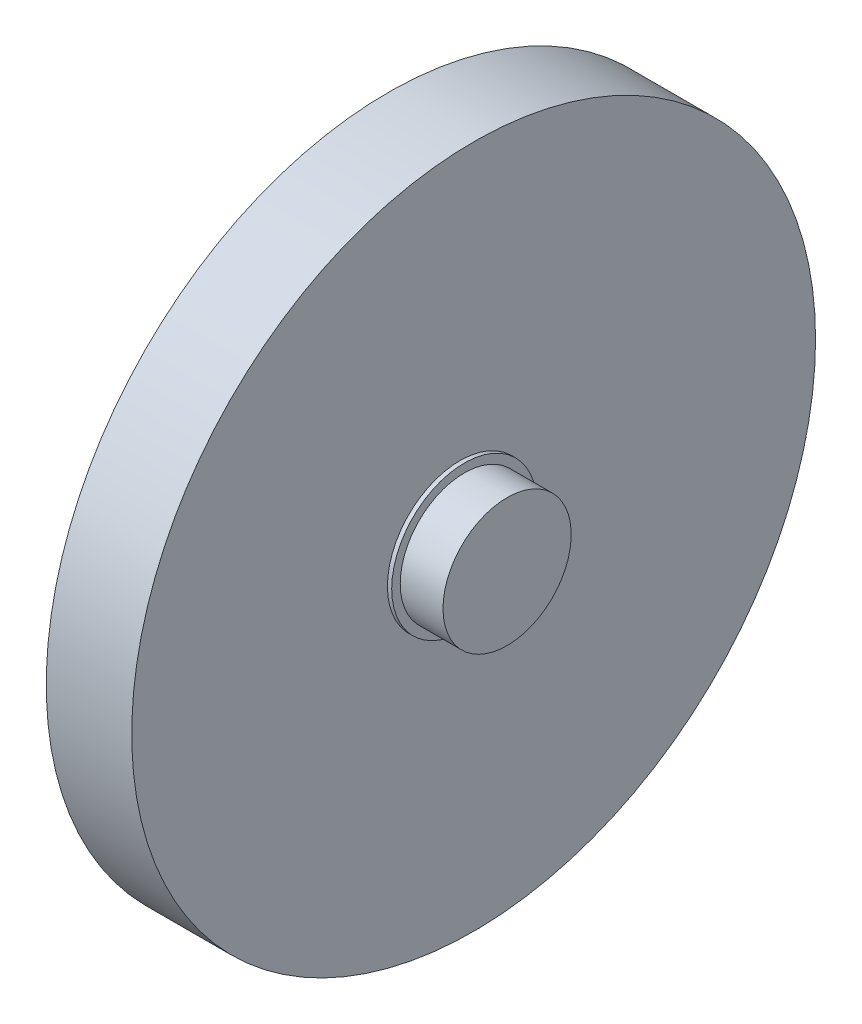
ISO-10303-21;
HEADER;
FILE_DESCRIPTION(('STEP AP214'),'2;1');
FILE_NAME('part.step','',(''),(''),'','','');
FILE_SCHEMA(('AUTOMOTIVE_DESIGN { 1 0 10303 214 1 1 1 1 }'));
ENDSEC;
DATA;
#1=APPLICATION_CONTEXT('core data for automotive mechanical design processes');
#2=APPLICATION_PROTOCOL_DEFINITION('international standard','automotive_design',2000,#1);
#3=PRODUCT_CONTEXT('',#1,'mechanical');
#4=PRODUCT('Part','Part','',(#3));
#5=PRODUCT_RELATED_PRODUCT_CATEGORY('part','',(#4));
#6=PRODUCT_DEFINITION_FORMATION('','',#4);
#7=PRODUCT_DEFINITION_CONTEXT('part definition',#1,'design');
#8=PRODUCT_DEFINITION('design','',#6,#7);
#9=PRODUCT_DEFINITION_SHAPE('','',#8);
#10=(LENGTH_UNIT() NAMED_UNIT(*) SI_UNIT(.MILLI.,.METRE.));
#11=(NAMED_UNIT(*) PLANE_ANGLE_UNIT() SI_UNIT($,.RADIAN.));
#12=(NAMED_UNIT(*) SI_UNIT($,.STERADIAN.) SOLID_ANGLE_UNIT());
#13=UNCERTAINTY_MEASURE_WITH_UNIT(LENGTH_MEASURE(1.E-05),#10,'distance_accuracy_value','');
#14=(GEOMETRIC_REPRESENTATION_CONTEXT(3) GLOBAL_UNCERTAINTY_ASSIGNED_CONTEXT((#13)) GLOBAL_UNIT_ASSIGNED_CONTEXT((#10,
#11,#12)) REPRESENTATION_CONTEXT('',''));
#15=CARTESIAN_POINT('',(0.,0.,0.));
#16=DIRECTION('',(0.,0.,1.));
#17=DIRECTION('',(1.,0.,0.));
#18=AXIS2_PLACEMENT_3D('',#15,#16,#17);
#19=CARTESIAN_POINT('',(7.,26.685292852244,8.67057724743726));
#20=DIRECTION('',(-1.,0.,0.));
#21=DIRECTION('',(0.,0.,1.));
#22=AXIS2_PLACEMENT_3D('',#19,#20,#21);
#23=CYLINDRICAL_SURFACE('',#22,6.86642262313004);
#24=CARTESIAN_POINT('',(0.,26.685292852244,8.67057724743726));
#25=DIRECTION('',(1.,0.,0.));
#26=DIRECTION('',(0.,0.,-1.));
#27=AXIS2_PLACEMENT_3D('',#24,#25,#26);
#28=CIRCLE('',#27,6.86642262313004);
#29=CARTESIAN_POINT('',(0.,30.1485889452472,2.74155204833238));
#30=VERTEX_POINT('',#29);
#31=CARTESIAN_POINT('',(0.,26.0021646755316,15.5029337613798));
#32=VERTEX_POINT('',#31);
#33=EDGE_CURVE('E218',#30,#32,#28,.T.);
#34=ORIENTED_EDGE('',*,*,#33,.F.);
#35=DIRECTION('',(-1.,0.,0.));
#36=VECTOR('',#35,1.);
#37=CARTESIAN_POINT('',(7.,30.1485889452472,2.74155204833238));
#38=LINE('',#37,#36);
#39=CARTESIAN_POINT('',(7.,30.1485889452472,2.74155204833238));
#40=VERTEX_POINT('',#39);
#41=EDGE_CURVE('E11',#40,#30,#38,.T.);
#42=ORIENTED_EDGE('',*,*,#41,.F.);
#43=CARTESIAN_POINT('',(7.,26.685292852244,8.67057724743726));
#44=DIRECTION('',(1.,0.,0.));
#45=DIRECTION('',(0.,0.,-1.));
#46=AXIS2_PLACEMENT_3D('',#43,#44,#45);
#47=CIRCLE('',#46,6.86642262313004);
#48=CARTESIAN_POINT('',(7.,26.0021646755316,15.5029337613798));
#49=VERTEX_POINT('',#48);
#50=EDGE_CURVE('E278',#40,#49,#47,.T.);
#51=ORIENTED_EDGE('',*,*,#50,.T.);
#52=DIRECTION('',(-1.,0.,0.));
#53=VECTOR('',#52,1.);
#54=CARTESIAN_POINT('',(7.,26.0021646755316,15.5029337613798));
#55=LINE('',#54,#53);
#56=EDGE_CURVE('E129',#49,#32,#55,.T.);
#57=ORIENTED_EDGE('',*,*,#56,.T.);
#58=EDGE_LOOP('',(#34,#42,#51,#57));
#59=FACE_BOUND('',#58,.T.);
#60=ADVANCED_FACE('F43',(#59),#23,.F.);
#61=CARTESIAN_POINT('',(7.,31.75,0.));
#62=DIRECTION('',(-1.,0.,0.));
#63=DIRECTION('',(0.,0.,1.));
#64=AXIS2_PLACEMENT_3D('',#61,#62,#63);
#65=CYLINDRICAL_SURFACE('',#64,3.175);
#66=CARTESIAN_POINT('',(0.,31.75,0.));
#67=DIRECTION('',(1.,0.,0.));
#68=DIRECTION('',(0.,0.,-1.));
#69=AXIS2_PLACEMENT_3D('',#66,#67,#68);
#70=CIRCLE('',#69,3.175);
#71=CARTESIAN_POINT('',(0.,30.1485889452472,-2.74155204833238));
#72=VERTEX_POINT('',#71);
#73=EDGE_CURVE('E221',#30,#72,#70,.T.);
#74=ORIENTED_EDGE('',*,*,#73,.T.);
#75=DIRECTION('',(-1.,0.,0.));
#76=VECTOR('',#75,1.);
#77=CARTESIAN_POINT('',(7.,30.1485889452472,-2.74155204833238));
#78=LINE('',#77,#76);
#79=CARTESIAN_POINT('',(7.,30.1485889452472,-2.74155204833238));
#80=VERTEX_POINT('',#79);
#81=EDGE_CURVE('E51',#80,#72,#78,.T.);
#82=ORIENTED_EDGE('',*,*,#81,.F.);
#83=CARTESIAN_POINT('',(7.,31.75,0.));
#84=DIRECTION('',(1.,0.,0.));
#85=DIRECTION('',(0.,0.,-1.));
#86=AXIS2_PLACEMENT_3D('',#83,#84,#85);
#87=CIRCLE('',#86,3.175);
#88=EDGE_CURVE('E333',#40,#80,#87,.T.);
#89=ORIENTED_EDGE('',*,*,#88,.F.);
#90=ORIENTED_EDGE('',*,*,#41,.T.);
#91=EDGE_LOOP('',(#74,#82,#89,#90));
#92=FACE_BOUND('',#91,.T.);
#93=ADVANCED_FACE('F317',(#92),#65,.T.);
#94=CARTESIAN_POINT('',(7.,26.6852928522439,-8.67057724743725));
#95=DIRECTION('',(-1.,0.,0.));
#96=DIRECTION('',(0.,0.,1.));
#97=AXIS2_PLACEMENT_3D('',#94,#95,#96);
#98=CYLINDRICAL_SURFACE('',#97,6.86642262313005);
#99=CARTESIAN_POINT('',(0.,26.6852928522439,-8.67057724743725));
#100=DIRECTION('',(1.,0.,0.));
#101=DIRECTION('',(0.,0.,-1.));
#102=AXIS2_PLACEMENT_3D('',#99,#100,#101);
#103=CIRCLE('',#102,6.86642262313005);
#104=CARTESIAN_POINT('',(0.,26.0021646755317,-15.5029337613799));
#105=VERTEX_POINT('',#104);
#106=EDGE_CURVE('E225',#105,#72,#103,.T.);
#107=ORIENTED_EDGE('',*,*,#106,.F.);
#108=DIRECTION('',(-1.,0.,0.));
#109=VECTOR('',#108,1.);
#110=CARTESIAN_POINT('',(7.,26.0021646755317,-15.5029337613799));
#111=LINE('',#110,#109);
#112=CARTESIAN_POINT('',(7.,26.0021646755317,-15.5029337613799));
#113=VERTEX_POINT('',#112);
#114=EDGE_CURVE('E307',#113,#105,#111,.T.);
#115=ORIENTED_EDGE('',*,*,#114,.F.);
#116=CARTESIAN_POINT('',(7.,26.6852928522439,-8.67057724743725));
#117=DIRECTION('',(1.,0.,0.));
#118=DIRECTION('',(0.,0.,-1.));
#119=AXIS2_PLACEMENT_3D('',#116,#117,#118);
#120=CIRCLE('',#119,6.86642262313005);
#121=EDGE_CURVE('E313',#113,#80,#120,.T.);
#122=ORIENTED_EDGE('',*,*,#121,.T.);
#123=ORIENTED_EDGE('',*,*,#81,.T.);
#124=EDGE_LOOP('',(#107,#115,#122,#123));
#125=FACE_BOUND('',#124,.T.);
#126=ADVANCED_FACE('F311',(#125),#98,.F.);
#127=CARTESIAN_POINT('',(7.,25.6862895714046,-18.662181760286));
#128=DIRECTION('',(-1.,0.,0.));
#129=DIRECTION('',(0.,0.,1.));
#130=AXIS2_PLACEMENT_3D('',#127,#128,#129);
#131=CYLINDRICAL_SURFACE('',#130,3.17499999999999);
#132=CARTESIAN_POINT('',(0.,25.6862895714046,-18.662181760286));
#133=DIRECTION('',(1.,0.,0.));
#134=DIRECTION('',(0.,0.,-1.));
#135=AXIS2_PLACEMENT_3D('',#132,#133,#134);
#136=CIRCLE('',#135,3.17499999999999);
#137=CARTESIAN_POINT('',(0.,22.7792769507277,-19.9388581575085));
#138=VERTEX_POINT('',#137);
#139=EDGE_CURVE('E228',#105,#138,#136,.T.);
#140=ORIENTED_EDGE('',*,*,#139,.T.);
#141=DIRECTION('',(-1.,0.,0.));
#142=VECTOR('',#141,1.);
#143=CARTESIAN_POINT('',(7.,22.7792769507277,-19.9388581575085));
#144=LINE('',#143,#142);
#145=CARTESIAN_POINT('',(7.,22.7792769507277,-19.9388581575085));
#146=VERTEX_POINT('',#145);
#147=EDGE_CURVE('E305',#146,#138,#144,.T.);
#148=ORIENTED_EDGE('',*,*,#147,.F.);
#149=CARTESIAN_POINT('',(7.,25.6862895714046,-18.662181760286));
#150=DIRECTION('',(1.,0.,0.));
#151=DIRECTION('',(0.,0.,-1.));
#152=AXIS2_PLACEMENT_3D('',#149,#150,#151);
#153=CIRCLE('',#152,3.17499999999999);
#154=EDGE_CURVE('E329',#113,#146,#153,.T.);
#155=ORIENTED_EDGE('',*,*,#154,.F.);
#156=ORIENTED_EDGE('',*,*,#114,.T.);
#157=EDGE_LOOP('',(#140,#148,#155,#156));
#158=FACE_BOUND('',#157,.T.);
#159=ADVANCED_FACE('F325',(#158),#131,.T.);
#160=CARTESIAN_POINT('',(7.,16.4924179824314,-22.6998659358722));
#161=DIRECTION('',(-1.,0.,0.));
#162=DIRECTION('',(0.,0.,1.));
#163=AXIS2_PLACEMENT_3D('',#160,#161,#162);
#164=CYLINDRICAL_SURFACE('',#163,6.86642262313004);
#165=CARTESIAN_POINT('',(0.,16.4924179824314,-22.6998659358722));
#166=DIRECTION('',(1.,0.,0.));
#167=DIRECTION('',(0.,0.,-1.));
#168=AXIS2_PLACEMENT_3D('',#165,#166,#167);
#169=CIRCLE('',#168,6.86642262313004);
#170=CARTESIAN_POINT('',(0.,11.9237972808349,-27.8258257995832));
#171=VERTEX_POINT('',#170);
#172=EDGE_CURVE('E231',#171,#138,#169,.T.);
#173=ORIENTED_EDGE('',*,*,#172,.F.);
#174=DIRECTION('',(-1.,0.,0.));
#175=VECTOR('',#174,1.);
#176=CARTESIAN_POINT('',(7.,11.9237972808349,-27.8258257995832));
#177=LINE('',#176,#175);
#178=CARTESIAN_POINT('',(7.,11.9237972808349,-27.8258257995832));
#179=VERTEX_POINT('',#178);
#180=EDGE_CURVE('E303',#179,#171,#177,.T.);
#181=ORIENTED_EDGE('',*,*,#180,.F.);
#182=CARTESIAN_POINT('',(7.,16.4924179824314,-22.6998659358722));
#183=DIRECTION('',(1.,0.,0.));
#184=DIRECTION('',(0.,0.,-1.));
#185=AXIS2_PLACEMENT_3D('',#182,#183,#184);
#186=CIRCLE('',#185,6.86642262313004);
#187=EDGE_CURVE('E331',#179,#146,#186,.T.);
#188=ORIENTED_EDGE('',*,*,#187,.T.);
#189=ORIENTED_EDGE('',*,*,#147,.T.);
#190=EDGE_LOOP('',(#173,#181,#188,#189));
#191=FACE_BOUND('',#190,.T.);
#192=ADVANCED_FACE('F676',(#191),#164,.F.);
#193=CARTESIAN_POINT('',(7.,9.81128957140458,-30.1960443923711));
#194=DIRECTION('',(-1.,0.,0.));
#195=DIRECTION('',(0.,0.,1.));
#196=AXIS2_PLACEMENT_3D('',#193,#194,#195);
#197=CYLINDRICAL_SURFACE('',#196,3.175);
#198=CARTESIAN_POINT('',(0.,9.81128957140458,-30.1960443923711));
#199=DIRECTION('',(1.,0.,0.));
#200=DIRECTION('',(0.,0.,-1.));
#201=AXIS2_PLACEMENT_3D('',#198,#199,#200);
#202=CIRCLE('',#201,3.175);
#203=CARTESIAN_POINT('',(0.,6.70905540017722,-29.5201981473795));
#204=VERTEX_POINT('',#203);
#205=EDGE_CURVE('E234',#171,#204,#202,.T.);
#206=ORIENTED_EDGE('',*,*,#205,.T.);
#207=DIRECTION('',(-1.,0.,0.));
#208=VECTOR('',#207,1.);
#209=CARTESIAN_POINT('',(7.,6.70905540017722,-29.5201981473795));
#210=LINE('',#209,#208);
#211=CARTESIAN_POINT('',(7.,6.70905540017722,-29.5201981473795));
#212=VERTEX_POINT('',#211);
#213=EDGE_CURVE('E301',#212,#204,#210,.T.);
#214=ORIENTED_EDGE('',*,*,#213,.F.);
#215=CARTESIAN_POINT('',(7.,9.81128957140458,-30.1960443923711));
#216=DIRECTION('',(1.,0.,0.));
#217=DIRECTION('',(0.,0.,-1.));
#218=AXIS2_PLACEMENT_3D('',#215,#216,#217);
#219=CIRCLE('',#218,3.175);
#220=EDGE_CURVE('E339',#179,#212,#219,.T.);
#221=ORIENTED_EDGE('',*,*,#220,.F.);
#222=ORIENTED_EDGE('',*,*,#180,.T.);
#223=EDGE_LOOP('',(#206,#214,#221,#222));
#224=FACE_BOUND('',#223,.T.);
#225=ADVANCED_FACE('F666',(#224),#197,.T.);
#226=CARTESIAN_POINT('',(7.,0.,-28.05857737687));
#227=DIRECTION('',(-1.,0.,0.));
#228=DIRECTION('',(0.,0.,1.));
#229=AXIS2_PLACEMENT_3D('',#226,#227,#228);
#230=CYLINDRICAL_SURFACE('',#229,6.86642262313004);
#231=CARTESIAN_POINT('',(0.,0.,-28.05857737687));
#232=DIRECTION('',(1.,0.,0.));
#233=DIRECTION('',(0.,0.,-1.));
#234=AXIS2_PLACEMENT_3D('',#231,#232,#233);
#235=CIRCLE('',#234,6.86642262313004);
#236=CARTESIAN_POINT('',(0.,-6.70905540017721,-29.5201981473795));
#237=VERTEX_POINT('',#236);
#238=EDGE_CURVE('E237',#237,#204,#235,.T.);
#239=ORIENTED_EDGE('',*,*,#238,.F.);
#240=DIRECTION('',(-1.,0.,0.));
#241=VECTOR('',#240,1.);
#242=CARTESIAN_POINT('',(7.,-6.70905540017721,-29.5201981473795));
#243=LINE('',#242,#241);
#244=CARTESIAN_POINT('',(7.,-6.70905540017721,-29.5201981473795));
#245=VERTEX_POINT('',#244);
#246=EDGE_CURVE('E299',#245,#237,#243,.T.);
#247=ORIENTED_EDGE('',*,*,#246,.F.);
#248=CARTESIAN_POINT('',(7.,0.,-28.05857737687));
#249=DIRECTION('',(1.,0.,0.));
#250=DIRECTION('',(0.,0.,-1.));
#251=AXIS2_PLACEMENT_3D('',#248,#249,#250);
#252=CIRCLE('',#251,6.86642262313004);
#253=EDGE_CURVE('E342',#245,#212,#252,.T.);
#254=ORIENTED_EDGE('',*,*,#253,.T.);
#255=ORIENTED_EDGE('',*,*,#213,.T.);
#256=EDGE_LOOP('',(#239,#247,#254,#255));
#257=FACE_BOUND('',#256,.T.);
#258=ADVANCED_FACE('F656',(#257),#230,.F.);
#259=CARTESIAN_POINT('',(7.,-9.81128957140458,-30.1960443923711));
#260=DIRECTION('',(-1.,0.,0.));
#261=DIRECTION('',(0.,0.,1.));
#262=AXIS2_PLACEMENT_3D('',#259,#260,#261);
#263=CYLINDRICAL_SURFACE('',#262,3.175);
#264=CARTESIAN_POINT('',(0.,-9.81128957140458,-30.1960443923711));
#265=DIRECTION('',(1.,0.,0.));
#266=DIRECTION('',(0.,0.,-1.));
#267=AXIS2_PLACEMENT_3D('',#264,#265,#266);
#268=CIRCLE('',#267,3.175);
#269=CARTESIAN_POINT('',(0.,-11.9237972808349,-27.8258257995832));
#270=VERTEX_POINT('',#269);
#271=EDGE_CURVE('E240',#237,#270,#268,.T.);
#272=ORIENTED_EDGE('',*,*,#271,.T.);
#273=DIRECTION('',(-1.,0.,0.));
#274=VECTOR('',#273,1.);
#275=CARTESIAN_POINT('',(7.,-11.9237972808349,-27.8258257995832));
#276=LINE('',#275,#274);
#277=CARTESIAN_POINT('',(7.,-11.9237972808349,-27.8258257995832));
#278=VERTEX_POINT('',#277);
#279=EDGE_CURVE('E297',#278,#270,#276,.T.);
#280=ORIENTED_EDGE('',*,*,#279,.F.);
#281=CARTESIAN_POINT('',(7.,-9.81128957140458,-30.1960443923711));
#282=DIRECTION('',(1.,0.,0.));
#283=DIRECTION('',(0.,0.,-1.));
#284=AXIS2_PLACEMENT_3D('',#281,#282,#283);
#285=CIRCLE('',#284,3.175);
#286=EDGE_CURVE('E345',#245,#278,#285,.T.);
#287=ORIENTED_EDGE('',*,*,#286,.F.);
#288=ORIENTED_EDGE('',*,*,#246,.T.);
#289=EDGE_LOOP('',(#272,#280,#287,#288));
#290=FACE_BOUND('',#289,.T.);
#291=ADVANCED_FACE('F646',(#290),#263,.T.);
#292=CARTESIAN_POINT('',(7.,-16.4924179824314,-22.6998659358722));
#293=DIRECTION('',(-1.,0.,0.));
#294=DIRECTION('',(0.,0.,1.));
#295=AXIS2_PLACEMENT_3D('',#292,#293,#294);
#296=CYLINDRICAL_SURFACE('',#295,6.86642262313004);
#297=CARTESIAN_POINT('',(0.,-16.4924179824314,-22.6998659358722));
#298=DIRECTION('',(1.,0.,0.));
#299=DIRECTION('',(0.,0.,-1.));
#300=AXIS2_PLACEMENT_3D('',#297,#298,#299);
#301=CIRCLE('',#300,6.86642262313004);
#302=CARTESIAN_POINT('',(0.,-22.7792769507276,-19.9388581575085));
#303=VERTEX_POINT('',#302);
#304=EDGE_CURVE('E243',#303,#270,#301,.T.);
#305=ORIENTED_EDGE('',*,*,#304,.F.);
#306=DIRECTION('',(-1.,0.,0.));
#307=VECTOR('',#306,1.);
#308=CARTESIAN_POINT('',(7.,-22.7792769507276,-19.9388581575085));
#309=LINE('',#308,#307);
#310=CARTESIAN_POINT('',(7.,-22.7792769507276,-19.9388581575085));
#311=VERTEX_POINT('',#310);
#312=EDGE_CURVE('E295',#311,#303,#309,.T.);
#313=ORIENTED_EDGE('',*,*,#312,.F.);
#314=CARTESIAN_POINT('',(7.,-16.4924179824314,-22.6998659358722));
#315=DIRECTION('',(1.,0.,0.));
#316=DIRECTION('',(0.,0.,-1.));
#317=AXIS2_PLACEMENT_3D('',#314,#315,#316);
#318=CIRCLE('',#317,6.86642262313004);
#319=EDGE_CURVE('E348',#311,#278,#318,.T.);
#320=ORIENTED_EDGE('',*,*,#319,.T.);
#321=ORIENTED_EDGE('',*,*,#279,.T.);
#322=EDGE_LOOP('',(#305,#313,#320,#321));
#323=FACE_BOUND('',#322,.T.);
#324=ADVANCED_FACE('F636',(#323),#296,.F.);
#325=CARTESIAN_POINT('',(7.,-25.6862895714046,-18.662181760286));
#326=DIRECTION('',(-1.,0.,0.));
#327=DIRECTION('',(0.,0.,1.));
#328=AXIS2_PLACEMENT_3D('',#325,#326,#327);
#329=CYLINDRICAL_SURFACE('',#328,3.175);
#330=CARTESIAN_POINT('',(0.,-25.6862895714046,-18.662181760286));
#331=DIRECTION('',(1.,0.,0.));
#332=DIRECTION('',(0.,0.,-1.));
#333=AXIS2_PLACEMENT_3D('',#330,#331,#332);
#334=CIRCLE('',#333,3.175);
#335=CARTESIAN_POINT('',(0.,-26.0021646755316,-15.5029337613798));
#336=VERTEX_POINT('',#335);
#337=EDGE_CURVE('E246',#303,#336,#334,.T.);
#338=ORIENTED_EDGE('',*,*,#337,.T.);
#339=DIRECTION('',(-1.,0.,0.));
#340=VECTOR('',#339,1.);
#341=CARTESIAN_POINT('',(7.,-26.0021646755316,-15.5029337613798));
#342=LINE('',#341,#340);
#343=CARTESIAN_POINT('',(7.,-26.0021646755316,-15.5029337613798));
#344=VERTEX_POINT('',#343);
#345=EDGE_CURVE('E293',#344,#336,#342,.T.);
#346=ORIENTED_EDGE('',*,*,#345,.F.);
#347=CARTESIAN_POINT('',(7.,-25.6862895714046,-18.662181760286));
#348=DIRECTION('',(1.,0.,0.));
#349=DIRECTION('',(0.,0.,-1.));
#350=AXIS2_PLACEMENT_3D('',#347,#348,#349);
#351=CIRCLE('',#350,3.175);
#352=EDGE_CURVE('E351',#311,#344,#351,.T.);
#353=ORIENTED_EDGE('',*,*,#352,.F.);
#354=ORIENTED_EDGE('',*,*,#312,.T.);
#355=EDGE_LOOP('',(#338,#346,#353,#354));
#356=FACE_BOUND('',#355,.T.);
#357=ADVANCED_FACE('F626',(#356),#329,.T.);
#358=CARTESIAN_POINT('',(7.,-26.685292852244,-8.67057724743726));
#359=DIRECTION('',(-1.,0.,0.));
#360=DIRECTION('',(0.,0.,1.));
#361=AXIS2_PLACEMENT_3D('',#358,#359,#360);
#362=CYLINDRICAL_SURFACE('',#361,6.86642262313004);
#363=CARTESIAN_POINT('',(0.,-26.685292852244,-8.67057724743726));
#364=DIRECTION('',(1.,0.,0.));
#365=DIRECTION('',(0.,0.,-1.));
#366=AXIS2_PLACEMENT_3D('',#363,#364,#365);
#367=CIRCLE('',#366,6.86642262313004);
#368=CARTESIAN_POINT('',(0.,-30.1485889452472,-2.74155204833238));
#369=VERTEX_POINT('',#368);
#370=EDGE_CURVE('E249',#369,#336,#367,.T.);
#371=ORIENTED_EDGE('',*,*,#370,.F.);
#372=DIRECTION('',(-1.,0.,0.));
#373=VECTOR('',#372,1.);
#374=CARTESIAN_POINT('',(7.,-30.1485889452472,-2.74155204833238));
#375=LINE('',#374,#373);
#376=CARTESIAN_POINT('',(7.,-30.1485889452472,-2.74155204833238));
#377=VERTEX_POINT('',#376);
#378=EDGE_CURVE('E291',#377,#369,#375,.T.);
#379=ORIENTED_EDGE('',*,*,#378,.F.);
#380=CARTESIAN_POINT('',(7.,-26.685292852244,-8.67057724743726));
#381=DIRECTION('',(1.,0.,0.));
#382=DIRECTION('',(0.,0.,-1.));
#383=AXIS2_PLACEMENT_3D('',#380,#381,#382);
#384=CIRCLE('',#383,6.86642262313004);
#385=EDGE_CURVE('E354',#377,#344,#384,.T.);
#386=ORIENTED_EDGE('',*,*,#385,.T.);
#387=ORIENTED_EDGE('',*,*,#345,.T.);
#388=EDGE_LOOP('',(#371,#379,#386,#387));
#389=FACE_BOUND('',#388,.T.);
#390=ADVANCED_FACE('F616',(#389),#362,.F.);
#391=CARTESIAN_POINT('',(7.,-31.75,0.));
#392=DIRECTION('',(-1.,0.,0.));
#393=DIRECTION('',(0.,0.,1.));
#394=AXIS2_PLACEMENT_3D('',#391,#392,#393);
#395=CYLINDRICAL_SURFACE('',#394,3.175);
#396=CARTESIAN_POINT('',(0.,-31.75,0.));
#397=DIRECTION('',(1.,0.,0.));
#398=DIRECTION('',(0.,0.,-1.));
#399=AXIS2_PLACEMENT_3D('',#396,#397,#398);
#400=CIRCLE('',#399,3.175);
#401=CARTESIAN_POINT('',(0.,-30.1485889452472,2.74155204833238));
#402=VERTEX_POINT('',#401);
#403=EDGE_CURVE('E252',#369,#402,#400,.T.);
#404=ORIENTED_EDGE('',*,*,#403,.T.);
#405=DIRECTION('',(-1.,0.,0.));
#406=VECTOR('',#405,1.);
#407=CARTESIAN_POINT('',(7.,-30.1485889452472,2.74155204833238));
#408=LINE('',#407,#406);
#409=CARTESIAN_POINT('',(7.,-30.1485889452472,2.74155204833238));
#410=VERTEX_POINT('',#409);
#411=EDGE_CURVE('E289',#410,#402,#408,.T.);
#412=ORIENTED_EDGE('',*,*,#411,.F.);
#413=CARTESIAN_POINT('',(7.,-31.75,0.));
#414=DIRECTION('',(1.,0.,0.));
#415=DIRECTION('',(0.,0.,-1.));
#416=AXIS2_PLACEMENT_3D('',#413,#414,#415);
#417=CIRCLE('',#416,3.175);
#418=EDGE_CURVE('E357',#377,#410,#417,.T.);
#419=ORIENTED_EDGE('',*,*,#418,.F.);
#420=ORIENTED_EDGE('',*,*,#378,.T.);
#421=EDGE_LOOP('',(#404,#412,#419,#420));
#422=FACE_BOUND('',#421,.T.);
#423=ADVANCED_FACE('F606',(#422),#395,.T.);
#424=CARTESIAN_POINT('',(7.,-26.685292852244,8.67057724743725));
#425=DIRECTION('',(-1.,0.,0.));
#426=DIRECTION('',(0.,0.,1.));
#427=AXIS2_PLACEMENT_3D('',#424,#425,#426);
#428=CYLINDRICAL_SURFACE('',#427,6.86642262313004);
#429=CARTESIAN_POINT('',(0.,-26.685292852244,8.67057724743725));
#430=DIRECTION('',(1.,0.,0.));
#431=DIRECTION('',(0.,0.,-1.));
#432=AXIS2_PLACEMENT_3D('',#429,#430,#431);
#433=CIRCLE('',#432,6.86642262313004);
#434=CARTESIAN_POINT('',(0.,-26.0021646755316,15.5029337613798));
#435=VERTEX_POINT('',#434);
#436=EDGE_CURVE('E255',#435,#402,#433,.T.);
#437=ORIENTED_EDGE('',*,*,#436,.F.);
#438=DIRECTION('',(-1.,0.,0.));
#439=VECTOR('',#438,1.);
#440=CARTESIAN_POINT('',(7.,-26.0021646755316,15.5029337613798));
#441=LINE('',#440,#439);
#442=CARTESIAN_POINT('',(7.,-26.0021646755316,15.5029337613798));
#443=VERTEX_POINT('',#442);
#444=EDGE_CURVE('E287',#443,#435,#441,.T.);
#445=ORIENTED_EDGE('',*,*,#444,.F.);
#446=CARTESIAN_POINT('',(7.,-26.685292852244,8.67057724743725));
#447=DIRECTION('',(1.,0.,0.));
#448=DIRECTION('',(0.,0.,-1.));
#449=AXIS2_PLACEMENT_3D('',#446,#447,#448);
#450=CIRCLE('',#449,6.86642262313004);
#451=EDGE_CURVE('E360',#443,#410,#450,.T.);
#452=ORIENTED_EDGE('',*,*,#451,.T.);
#453=ORIENTED_EDGE('',*,*,#411,.T.);
#454=EDGE_LOOP('',(#437,#445,#452,#453));
#455=FACE_BOUND('',#454,.T.);
#456=ADVANCED_FACE('F597',(#455),#428,.F.);
#457=CARTESIAN_POINT('',(7.,-25.6862895714046,18.662181760286));
#458=DIRECTION('',(-1.,0.,0.));
#459=DIRECTION('',(0.,0.,1.));
#460=AXIS2_PLACEMENT_3D('',#457,#458,#459);
#461=CYLINDRICAL_SURFACE('',#460,3.175);
#462=CARTESIAN_POINT('',(0.,-25.6862895714046,18.662181760286));
#463=DIRECTION('',(1.,0.,0.));
#464=DIRECTION('',(0.,0.,-1.));
#465=AXIS2_PLACEMENT_3D('',#462,#463,#464);
#466=CIRCLE('',#465,3.175);
#467=CARTESIAN_POINT('',(0.,-22.7792769507277,19.9388581575085));
#468=VERTEX_POINT('',#467);
#469=EDGE_CURVE('E258',#435,#468,#466,.T.);
#470=ORIENTED_EDGE('',*,*,#469,.T.);
#471=DIRECTION('',(-1.,0.,0.));
#472=VECTOR('',#471,1.);
#473=CARTESIAN_POINT('',(7.,-22.7792769507277,19.9388581575085));
#474=LINE('',#473,#472);
#475=CARTESIAN_POINT('',(7.,-22.7792769507277,19.9388581575085));
#476=VERTEX_POINT('',#475);
#477=EDGE_CURVE('E285',#476,#468,#474,.T.);
#478=ORIENTED_EDGE('',*,*,#477,.F.);
#479=CARTESIAN_POINT('',(7.,-25.6862895714046,18.662181760286));
#480=DIRECTION('',(1.,0.,0.));
#481=DIRECTION('',(0.,0.,-1.));
#482=AXIS2_PLACEMENT_3D('',#479,#480,#481);
#483=CIRCLE('',#482,3.175);
#484=EDGE_CURVE('E363',#443,#476,#483,.T.);
#485=ORIENTED_EDGE('',*,*,#484,.F.);
#486=ORIENTED_EDGE('',*,*,#444,.T.);
#487=EDGE_LOOP('',(#470,#478,#485,#486));
#488=FACE_BOUND('',#487,.T.);
#489=ADVANCED_FACE('F372',(#488),#461,.T.);
#490=CARTESIAN_POINT('',(7.,-16.4924179824314,22.6998659358722));
#491=DIRECTION('',(-1.,0.,0.));
#492=DIRECTION('',(0.,0.,1.));
#493=AXIS2_PLACEMENT_3D('',#490,#491,#492);
#494=CYLINDRICAL_SURFACE('',#493,6.86642262313004);
#495=CARTESIAN_POINT('',(0.,-16.4924179824314,22.6998659358722));
#496=DIRECTION('',(1.,0.,0.));
#497=DIRECTION('',(0.,0.,-1.));
#498=AXIS2_PLACEMENT_3D('',#495,#496,#497);
#499=CIRCLE('',#498,6.86642262313004);
#500=CARTESIAN_POINT('',(0.,-11.9237972808349,27.8258257995832));
#501=VERTEX_POINT('',#500);
#502=EDGE_CURVE('E261',#501,#468,#499,.T.);
#503=ORIENTED_EDGE('',*,*,#502,.F.);
#504=DIRECTION('',(-1.,0.,0.));
#505=VECTOR('',#504,1.);
#506=CARTESIAN_POINT('',(7.,-11.9237972808349,27.8258257995832));
#507=LINE('',#506,#505);
#508=CARTESIAN_POINT('',(7.,-11.9237972808349,27.8258257995832));
#509=VERTEX_POINT('',#508);
#510=EDGE_CURVE('E283',#509,#501,#507,.T.);
#511=ORIENTED_EDGE('',*,*,#510,.F.);
#512=CARTESIAN_POINT('',(7.,-16.4924179824314,22.6998659358722));
#513=DIRECTION('',(1.,0.,0.));
#514=DIRECTION('',(0.,0.,-1.));
#515=AXIS2_PLACEMENT_3D('',#512,#513,#514);
#516=CIRCLE('',#515,6.86642262313004);
#517=EDGE_CURVE('E210',#509,#476,#516,.T.);
#518=ORIENTED_EDGE('',*,*,#517,.T.);
#519=ORIENTED_EDGE('',*,*,#477,.T.);
#520=EDGE_LOOP('',(#503,#511,#518,#519));
#521=FACE_BOUND('',#520,.T.);
#522=ADVANCED_FACE('F368',(#521),#494,.F.);
#523=CARTESIAN_POINT('',(7.,-9.81128957140459,30.1960443923711));
#524=DIRECTION('',(-1.,0.,0.));
#525=DIRECTION('',(0.,0.,1.));
#526=AXIS2_PLACEMENT_3D('',#523,#524,#525);
#527=CYLINDRICAL_SURFACE('',#526,3.175);
#528=CARTESIAN_POINT('',(0.,-9.81128957140459,30.1960443923711));
#529=DIRECTION('',(1.,0.,0.));
#530=DIRECTION('',(0.,0.,-1.));
#531=AXIS2_PLACEMENT_3D('',#528,#529,#530);
#532=CIRCLE('',#531,3.175);
#533=CARTESIAN_POINT('',(0.,-6.70905540017722,29.5201981473795));
#534=VERTEX_POINT('',#533);
#535=EDGE_CURVE('E264',#501,#534,#532,.T.);
#536=ORIENTED_EDGE('',*,*,#535,.T.);
#537=DIRECTION('',(-1.,0.,0.));
#538=VECTOR('',#537,1.);
#539=CARTESIAN_POINT('',(7.,-6.70905540017722,29.5201981473795));
#540=LINE('',#539,#538);
#541=CARTESIAN_POINT('',(7.,-6.70905540017722,29.5201981473795));
#542=VERTEX_POINT('',#541);
#543=EDGE_CURVE('E194',#542,#534,#540,.T.);
#544=ORIENTED_EDGE('',*,*,#543,.F.);
#545=CARTESIAN_POINT('',(7.,-9.81128957140459,30.1960443923711));
#546=DIRECTION('',(1.,0.,0.));
#547=DIRECTION('',(0.,0.,-1.));
#548=AXIS2_PLACEMENT_3D('',#545,#546,#547);
#549=CIRCLE('',#548,3.175);
#550=EDGE_CURVE('E208',#509,#542,#549,.T.);
#551=ORIENTED_EDGE('',*,*,#550,.F.);
#552=ORIENTED_EDGE('',*,*,#510,.T.);
#553=EDGE_LOOP('',(#536,#544,#551,#552));
#554=FACE_BOUND('',#553,.T.);
#555=ADVANCED_FACE('F377',(#554),#527,.T.);
#556=CARTESIAN_POINT('',(7.,0.,28.05857737687));
#557=DIRECTION('',(-1.,0.,0.));
#558=DIRECTION('',(0.,0.,1.));
#559=AXIS2_PLACEMENT_3D('',#556,#557,#558);
#560=CYLINDRICAL_SURFACE('',#559,6.86642262313004);
#561=CARTESIAN_POINT('',(0.,0.,28.05857737687));
#562=DIRECTION('',(1.,0.,0.));
#563=DIRECTION('',(0.,0.,-1.));
#564=AXIS2_PLACEMENT_3D('',#561,#562,#563);
#565=CIRCLE('',#564,6.86642262313004);
#566=CARTESIAN_POINT('',(0.,6.70905540017721,29.5201981473795));
#567=VERTEX_POINT('',#566);
#568=EDGE_CURVE('E190',#567,#534,#565,.T.);
#569=ORIENTED_EDGE('',*,*,#568,.F.);
#570=DIRECTION('',(-1.,0.,0.));
#571=VECTOR('',#570,1.);
#572=CARTESIAN_POINT('',(7.,6.70905540017721,29.5201981473795));
#573=LINE('',#572,#571);
#574=CARTESIAN_POINT('',(7.,6.70905540017721,29.5201981473795));
#575=VERTEX_POINT('',#574);
#576=EDGE_CURVE('E183',#575,#567,#573,.T.);
#577=ORIENTED_EDGE('',*,*,#576,.F.);
#578=CARTESIAN_POINT('',(7.,0.,28.05857737687));
#579=DIRECTION('',(1.,0.,0.));
#580=DIRECTION('',(0.,0.,-1.));
#581=AXIS2_PLACEMENT_3D('',#578,#579,#580);
#582=CIRCLE('',#581,6.86642262313004);
#583=EDGE_CURVE('E187',#575,#542,#582,.T.);
#584=ORIENTED_EDGE('',*,*,#583,.T.);
#585=ORIENTED_EDGE('',*,*,#543,.T.);
#586=EDGE_LOOP('',(#569,#577,#584,#585));
#587=FACE_BOUND('',#586,.T.);
#588=ADVANCED_FACE('F185',(#587),#560,.F.);
#589=CARTESIAN_POINT('',(7.,9.81128957140458,30.1960443923711));
#590=DIRECTION('',(-1.,0.,0.));
#591=DIRECTION('',(0.,0.,1.));
#592=AXIS2_PLACEMENT_3D('',#589,#590,#591);
#593=CYLINDRICAL_SURFACE('',#592,3.175);
#594=CARTESIAN_POINT('',(0.,9.81128957140458,30.1960443923711));
#595=DIRECTION('',(1.,0.,0.));
#596=DIRECTION('',(0.,0.,-1.));
#597=AXIS2_PLACEMENT_3D('',#594,#595,#596);
#598=CIRCLE('',#597,3.175);
#599=CARTESIAN_POINT('',(0.,11.9237972808349,27.8258257995832));
#600=VERTEX_POINT('',#599);
#601=EDGE_CURVE('E268',#567,#600,#598,.T.);
#602=ORIENTED_EDGE('',*,*,#601,.T.);
#603=DIRECTION('',(-1.,0.,0.));
#604=VECTOR('',#603,1.);
#605=CARTESIAN_POINT('',(7.,11.9237972808349,27.8258257995832));
#606=LINE('',#605,#604);
#607=CARTESIAN_POINT('',(7.,11.9237972808349,27.8258257995832));
#608=VERTEX_POINT('',#607);
#609=EDGE_CURVE('E195',#608,#600,#606,.T.);
#610=ORIENTED_EDGE('',*,*,#609,.F.);
#611=CARTESIAN_POINT('',(7.,9.81128957140458,30.1960443923711));
#612=DIRECTION('',(1.,0.,0.));
#613=DIRECTION('',(0.,0.,-1.));
#614=AXIS2_PLACEMENT_3D('',#611,#612,#613);
#615=CIRCLE('',#614,3.175);
#616=EDGE_CURVE('E198',#575,#608,#615,.T.);
#617=ORIENTED_EDGE('',*,*,#616,.F.);
#618=ORIENTED_EDGE('',*,*,#576,.T.);
#619=EDGE_LOOP('',(#602,#610,#617,#618));
#620=FACE_BOUND('',#619,.T.);
#621=ADVANCED_FACE('F199',(#620),#593,.T.);
#622=CARTESIAN_POINT('',(7.,16.4924179824314,22.6998659358722));
#623=DIRECTION('',(-1.,0.,0.));
#624=DIRECTION('',(0.,0.,1.));
#625=AXIS2_PLACEMENT_3D('',#622,#623,#624);
#626=CYLINDRICAL_SURFACE('',#625,6.86642262313004);
#627=CARTESIAN_POINT('',(0.,16.4924179824314,22.6998659358722));
#628=DIRECTION('',(1.,0.,0.));
#629=DIRECTION('',(0.,0.,-1.));
#630=AXIS2_PLACEMENT_3D('',#627,#628,#629);
#631=CIRCLE('',#630,6.86642262313004);
#632=CARTESIAN_POINT('',(0.,22.7792769507276,19.9388581575085));
#633=VERTEX_POINT('',#632);
#634=EDGE_CURVE('E270',#633,#600,#631,.T.);
#635=ORIENTED_EDGE('',*,*,#634,.F.);
#636=DIRECTION('',(-1.,0.,0.));
#637=VECTOR('',#636,1.);
#638=CARTESIAN_POINT('',(7.,22.7792769507276,19.9388581575085));
#639=LINE('',#638,#637);
#640=CARTESIAN_POINT('',(7.,22.7792769507276,19.9388581575085));
#641=VERTEX_POINT('',#640);
#642=EDGE_CURVE('E59',#641,#633,#639,.T.);
#643=ORIENTED_EDGE('',*,*,#642,.F.);
#644=CARTESIAN_POINT('',(7.,16.4924179824314,22.6998659358722));
#645=DIRECTION('',(1.,0.,0.));
#646=DIRECTION('',(0.,0.,-1.));
#647=AXIS2_PLACEMENT_3D('',#644,#645,#646);
#648=CIRCLE('',#647,6.86642262313004);
#649=EDGE_CURVE('E202',#641,#608,#648,.T.);
#650=ORIENTED_EDGE('',*,*,#649,.T.);
#651=ORIENTED_EDGE('',*,*,#609,.T.);
#652=EDGE_LOOP('',(#635,#643,#650,#651));
#653=FACE_BOUND('',#652,.T.);
#654=ADVANCED_FACE('F390',(#653),#626,.F.);
#655=CARTESIAN_POINT('',(7.,25.6862895714046,18.662181760286));
#656=DIRECTION('',(-1.,0.,0.));
#657=DIRECTION('',(0.,0.,1.));
#658=AXIS2_PLACEMENT_3D('',#655,#656,#657);
#659=CYLINDRICAL_SURFACE('',#658,3.175);
#660=CARTESIAN_POINT('',(0.,25.6862895714046,18.662181760286));
#661=DIRECTION('',(1.,0.,0.));
#662=DIRECTION('',(0.,0.,-1.));
#663=AXIS2_PLACEMENT_3D('',#660,#661,#662);
#664=CIRCLE('',#663,3.175);
#665=EDGE_CURVE('E273',#633,#32,#664,.T.);
#666=ORIENTED_EDGE('',*,*,#665,.T.);
#667=ORIENTED_EDGE('',*,*,#56,.F.);
#668=CARTESIAN_POINT('',(7.,25.6862895714046,18.662181760286));
#669=DIRECTION('',(1.,0.,0.));
#670=DIRECTION('',(0.,0.,-1.));
#671=AXIS2_PLACEMENT_3D('',#668,#669,#670);
#672=CIRCLE('',#671,3.175);
#673=EDGE_CURVE('E215',#641,#49,#672,.T.);
#674=ORIENTED_EDGE('',*,*,#673,.F.);
#675=ORIENTED_EDGE('',*,*,#642,.T.);
#676=EDGE_LOOP('',(#666,#667,#674,#675));
#677=FACE_BOUND('',#676,.T.);
#678=ADVANCED_FACE('F391',(#677),#659,.T.);
#679=CARTESIAN_POINT('',(7.,0.,-1.5875));
#680=DIRECTION('',(-1.,0.,0.));
#681=DIRECTION('',(0.,0.,1.));
#682=AXIS2_PLACEMENT_3D('',#679,#680,#681);
#683=CYLINDRICAL_SURFACE('',#682,40.);
#684=CARTESIAN_POINT('',(0.,0.,-1.5875));
#685=DIRECTION('',(1.,0.,0.));
#686=DIRECTION('',(0.,0.,-1.));
#687=AXIS2_PLACEMENT_3D('',#684,#685,#686);
#688=CIRCLE('',#687,40.);
#689=CARTESIAN_POINT('',(0.,0.,-41.5875));
#690=VERTEX_POINT('',#689);
#691=EDGE_CURVE('E275',#690,#690,#688,.T.);
#692=ORIENTED_EDGE('',*,*,#691,.T.);
#693=EDGE_LOOP('',(#692));
#694=FACE_BOUND('',#693,.T.);
#695=CARTESIAN_POINT('',(10.,0.,-1.5875));
#696=DIRECTION('',(1.,0.,0.));
#697=DIRECTION('',(0.,0.,-1.));
#698=AXIS2_PLACEMENT_3D('',#695,#696,#697);
#699=CIRCLE('',#698,40.);
#700=CARTESIAN_POINT('',(10.,0.,-41.5875));
#701=VERTEX_POINT('',#700);
#702=EDGE_CURVE('E803',#701,#701,#699,.T.);
#703=ORIENTED_EDGE('',*,*,#702,.F.);
#704=EDGE_LOOP('',(#703));
#705=FACE_BOUND('',#704,.T.);
#706=ADVANCED_FACE('F393',(#694,#705),#683,.T.);
#707=CARTESIAN_POINT('',(0.,0.,0.));
#708=DIRECTION('',(1.,0.,0.));
#709=DIRECTION('',(0.,0.,-1.));
#710=AXIS2_PLACEMENT_3D('',#707,#708,#709);
#711=PLANE('',#710);
#712=ORIENTED_EDGE('',*,*,#33,.T.);
#713=ORIENTED_EDGE('',*,*,#665,.F.);
#714=ORIENTED_EDGE('',*,*,#634,.T.);
#715=ORIENTED_EDGE('',*,*,#601,.F.);
#716=ORIENTED_EDGE('',*,*,#568,.T.);
#717=ORIENTED_EDGE('',*,*,#535,.F.);
#718=ORIENTED_EDGE('',*,*,#502,.T.);
#719=ORIENTED_EDGE('',*,*,#469,.F.);
#720=ORIENTED_EDGE('',*,*,#436,.T.);
#721=ORIENTED_EDGE('',*,*,#403,.F.);
#722=ORIENTED_EDGE('',*,*,#370,.T.);
#723=ORIENTED_EDGE('',*,*,#337,.F.);
#724=ORIENTED_EDGE('',*,*,#304,.T.);
#725=ORIENTED_EDGE('',*,*,#271,.F.);
#726=ORIENTED_EDGE('',*,*,#238,.T.);
#727=ORIENTED_EDGE('',*,*,#205,.F.);
#728=ORIENTED_EDGE('',*,*,#172,.T.);
#729=ORIENTED_EDGE('',*,*,#139,.F.);
#730=ORIENTED_EDGE('',*,*,#106,.T.);
#731=ORIENTED_EDGE('',*,*,#73,.F.);
#732=EDGE_LOOP('',(#712,#713,#714,#715,#716,#717,#718,#719,#720,#721,#722,#723,#724,#725,#726,
#727,#728,#729,#730,#731));
#733=FACE_BOUND('',#732,.T.);
#734=ORIENTED_EDGE('',*,*,#691,.F.);
#735=EDGE_LOOP('',(#734));
#736=FACE_BOUND('',#735,.T.);
#737=ADVANCED_FACE('F320',(#733,#736),#711,.F.);
#738=CARTESIAN_POINT('',(7.,0.,-1.5875));
#739=DIRECTION('',(1.,0.,0.));
#740=DIRECTION('',(0.,0.,-1.));
#741=AXIS2_PLACEMENT_3D('',#738,#739,#740);
#742=PLANE('',#741);
#743=CARTESIAN_POINT('',(7.,0.,0.));
#744=DIRECTION('',(1.,0.,0.));
#745=DIRECTION('',(0.,0.,-1.));
#746=AXIS2_PLACEMENT_3D('',#743,#744,#745);
#747=CIRCLE('',#746,4.);
#748=CARTESIAN_POINT('',(7.,0.,-4.));
#749=VERTEX_POINT('',#748);
#750=EDGE_CURVE('E222',#749,#749,#747,.T.);
#751=ORIENTED_EDGE('',*,*,#750,.T.);
#752=EDGE_LOOP('',(#751));
#753=FACE_BOUND('',#752,.T.);
#754=ORIENTED_EDGE('',*,*,#50,.F.);
#755=ORIENTED_EDGE('',*,*,#88,.T.);
#756=ORIENTED_EDGE('',*,*,#121,.F.);
#757=ORIENTED_EDGE('',*,*,#154,.T.);
#758=ORIENTED_EDGE('',*,*,#187,.F.);
#759=ORIENTED_EDGE('',*,*,#220,.T.);
#760=ORIENTED_EDGE('',*,*,#253,.F.);
#761=ORIENTED_EDGE('',*,*,#286,.T.);
#762=ORIENTED_EDGE('',*,*,#319,.F.);
#763=ORIENTED_EDGE('',*,*,#352,.T.);
#764=ORIENTED_EDGE('',*,*,#385,.F.);
#765=ORIENTED_EDGE('',*,*,#418,.T.);
#766=ORIENTED_EDGE('',*,*,#451,.F.);
#767=ORIENTED_EDGE('',*,*,#484,.T.);
#768=ORIENTED_EDGE('',*,*,#517,.F.);
#769=ORIENTED_EDGE('',*,*,#550,.T.);
#770=ORIENTED_EDGE('',*,*,#583,.F.);
#771=ORIENTED_EDGE('',*,*,#616,.T.);
#772=ORIENTED_EDGE('',*,*,#649,.F.);
#773=ORIENTED_EDGE('',*,*,#673,.T.);
#774=EDGE_LOOP('',(#754,#755,#756,#757,#758,#759,#760,#761,#762,#763,#764,#765,#766,#767,#768,
#769,#770,#771,#772,#773));
#775=FACE_BOUND('',#774,.T.);
#776=ADVANCED_FACE('F205',(#753,#775),#742,.F.);
#777=CARTESIAN_POINT('',(9.5,0.,0.));
#778=DIRECTION('',(-1.,0.,0.));
#779=DIRECTION('',(0.,0.,1.));
#780=AXIS2_PLACEMENT_3D('',#777,#778,#779);
#781=CYLINDRICAL_SURFACE('',#780,4.);
#782=CARTESIAN_POINT('',(9.5,0.,0.));
#783=DIRECTION('',(1.,0.,0.));
#784=DIRECTION('',(0.,0.,-1.));
#785=AXIS2_PLACEMENT_3D('',#782,#783,#784);
#786=CIRCLE('',#785,4.);
#787=CARTESIAN_POINT('',(9.5,0.,-4.));
#788=VERTEX_POINT('',#787);
#789=EDGE_CURVE('E811',#788,#788,#786,.T.);
#790=ORIENTED_EDGE('',*,*,#789,.T.);
#791=EDGE_LOOP('',(#790));
#792=FACE_BOUND('',#791,.T.);
#793=ORIENTED_EDGE('',*,*,#750,.F.);
#794=EDGE_LOOP('',(#793));
#795=FACE_BOUND('',#794,.T.);
#796=ADVANCED_FACE('F429',(#792,#795),#781,.F.);
#797=CARTESIAN_POINT('',(9.5,0.,0.));
#798=DIRECTION('',(1.,0.,0.));
#799=DIRECTION('',(0.,0.,-1.));
#800=AXIS2_PLACEMENT_3D('',#797,#798,#799);
#801=PLANE('',#800);
#802=CARTESIAN_POINT('',(9.5,0.,0.));
#803=DIRECTION('',(1.,0.,0.));
#804=DIRECTION('',(0.,0.,-1.));
#805=AXIS2_PLACEMENT_3D('',#802,#803,#804);
#806=CIRCLE('',#805,3.75);
#807=CARTESIAN_POINT('',(9.5,0.,-3.75));
#808=VERTEX_POINT('',#807);
#809=EDGE_CURVE('E799',#808,#808,#806,.T.);
#810=ORIENTED_EDGE('',*,*,#809,.T.);
#811=EDGE_LOOP('',(#810));
#812=FACE_BOUND('',#811,.T.);
#813=ORIENTED_EDGE('',*,*,#789,.F.);
#814=EDGE_LOOP('',(#813));
#815=FACE_BOUND('',#814,.T.);
#816=ADVANCED_FACE('F442',(#812,#815),#801,.F.);
#817=CARTESIAN_POINT('',(10.,0.,0.));
#818=DIRECTION('',(-1.,0.,0.));
#819=DIRECTION('',(0.,0.,1.));
#820=AXIS2_PLACEMENT_3D('',#817,#818,#819);
#821=CYLINDRICAL_SURFACE('',#820,3.75);
#822=ORIENTED_EDGE('',*,*,#809,.F.);
#823=EDGE_LOOP('',(#822));
#824=FACE_BOUND('',#823,.T.);
#825=CARTESIAN_POINT('',(12.325,0.,0.));
#826=DIRECTION('',(-1.,0.,0.));
#827=DIRECTION('',(0.,0.,1.));
#828=AXIS2_PLACEMENT_3D('',#825,#826,#827);
#829=CIRCLE('',#828,3.75);
#830=CARTESIAN_POINT('',(12.325,0.,3.75));
#831=VERTEX_POINT('',#830);
#832=EDGE_CURVE('E797',#831,#831,#829,.T.);
#833=ORIENTED_EDGE('',*,*,#832,.F.);
#834=EDGE_LOOP('',(#833));
#835=FACE_BOUND('',#834,.T.);
#836=ADVANCED_FACE('F460',(#824,#835),#821,.F.);
#837=CARTESIAN_POINT('',(10.,0.,0.));
#838=DIRECTION('',(1.,0.,0.));
#839=DIRECTION('',(0.,0.,-1.));
#840=AXIS2_PLACEMENT_3D('',#837,#838,#839);
#841=PLANE('',#840);
#842=CARTESIAN_POINT('',(10.,0.,0.));
#843=DIRECTION('',(-1.,0.,0.));
#844=DIRECTION('',(0.,0.,1.));
#845=AXIS2_PLACEMENT_3D('',#842,#843,#844);
#846=CIRCLE('',#845,8.5);
#847=CARTESIAN_POINT('',(10.,0.,8.5));
#848=VERTEX_POINT('',#847);
#849=EDGE_CURVE('E828',#848,#848,#846,.T.);
#850=ORIENTED_EDGE('',*,*,#849,.T.);
#851=EDGE_LOOP('',(#850));
#852=FACE_BOUND('',#851,.T.);
#853=ORIENTED_EDGE('',*,*,#702,.T.);
#854=EDGE_LOOP('',(#853));
#855=FACE_BOUND('',#854,.T.);
#856=ADVANCED_FACE('F471',(#852,#855),#841,.T.);
#857=CARTESIAN_POINT('',(12.325,0.,0.));
#858=DIRECTION('',(-1.,0.,0.));
#859=DIRECTION('',(0.,0.,1.));
#860=AXIS2_PLACEMENT_3D('',#857,#858,#859);
#861=CYLINDRICAL_SURFACE('',#860,8.5);
#862=ORIENTED_EDGE('',*,*,#849,.F.);
#863=EDGE_LOOP('',(#862));
#864=FACE_BOUND('',#863,.T.);
#865=CARTESIAN_POINT('',(10.5,0.,0.));
#866=DIRECTION('',(-1.,0.,0.));
#867=DIRECTION('',(0.,0.,1.));
#868=AXIS2_PLACEMENT_3D('',#865,#866,#867);
#869=CIRCLE('',#868,8.5);
#870=CARTESIAN_POINT('',(10.5,0.,8.5));
#871=VERTEX_POINT('',#870);
#872=EDGE_CURVE('E825',#871,#871,#869,.T.);
#873=ORIENTED_EDGE('',*,*,#872,.T.);
#874=EDGE_LOOP('',(#873));
#875=FACE_BOUND('',#874,.T.);
#876=ADVANCED_FACE('F482',(#864,#875),#861,.T.);
#877=CARTESIAN_POINT('',(10.5,8.5,0.));
#878=DIRECTION('',(-1.,0.,0.));
#879=DIRECTION('',(0.,0.,1.));
#880=AXIS2_PLACEMENT_3D('',#877,#878,#879);
#881=PLANE('',#880);
#882=ORIENTED_EDGE('',*,*,#872,.F.);
#883=EDGE_LOOP('',(#882));
#884=FACE_BOUND('',#883,.T.);
#885=CARTESIAN_POINT('',(10.5,0.,0.));
#886=DIRECTION('',(-1.,0.,0.));
#887=DIRECTION('',(0.,0.,1.));
#888=AXIS2_PLACEMENT_3D('',#885,#886,#887);
#889=CIRCLE('',#888,7.5);
#890=CARTESIAN_POINT('',(10.5,0.,7.5));
#891=VERTEX_POINT('',#890);
#892=EDGE_CURVE('E806',#891,#891,#889,.T.);
#893=ORIENTED_EDGE('',*,*,#892,.T.);
#894=EDGE_LOOP('',(#893));
#895=FACE_BOUND('',#894,.T.);
#896=ADVANCED_FACE('F492',(#884,#895),#881,.F.);
#897=CARTESIAN_POINT('',(12.325,0.,0.));
#898=DIRECTION('',(-1.,0.,0.));
#899=DIRECTION('',(0.,0.,1.));
#900=AXIS2_PLACEMENT_3D('',#897,#898,#899);
#901=CYLINDRICAL_SURFACE('',#900,7.5);
#902=ORIENTED_EDGE('',*,*,#892,.F.);
#903=EDGE_LOOP('',(#902));
#904=FACE_BOUND('',#903,.T.);
#905=CARTESIAN_POINT('',(15.5,0.,0.));
#906=DIRECTION('',(-1.,0.,0.));
#907=DIRECTION('',(0.,0.,1.));
#908=AXIS2_PLACEMENT_3D('',#905,#906,#907);
#909=CIRCLE('',#908,7.5);
#910=CARTESIAN_POINT('',(15.5,0.,7.5));
#911=VERTEX_POINT('',#910);
#912=EDGE_CURVE('E800',#911,#911,#909,.T.);
#913=ORIENTED_EDGE('',*,*,#912,.T.);
#914=EDGE_LOOP('',(#913));
#915=FACE_BOUND('',#914,.T.);
#916=ADVANCED_FACE('F503',(#904,#915),#901,.T.);
#917=CARTESIAN_POINT('',(15.5,7.5,0.));
#918=DIRECTION('',(-1.,0.,0.));
#919=DIRECTION('',(0.,0.,1.));
#920=AXIS2_PLACEMENT_3D('',#917,#918,#919);
#921=PLANE('',#920);
#922=ORIENTED_EDGE('',*,*,#912,.F.);
#923=EDGE_LOOP('',(#922));
#924=FACE_BOUND('',#923,.T.);
#925=ADVANCED_FACE('F514',(#924),#921,.F.);
#926=CARTESIAN_POINT('',(12.325,3.75,0.));
#927=DIRECTION('',(1.,0.,0.));
#928=DIRECTION('',(0.,0.,-1.));
#929=AXIS2_PLACEMENT_3D('',#926,#927,#928);
#930=PLANE('',#929);
#931=ORIENTED_EDGE('',*,*,#832,.T.);
#932=EDGE_LOOP('',(#931));
#933=FACE_BOUND('',#932,.T.);
#934=ADVANCED_FACE('F525',(#933),#930,.F.);
#935=CLOSED_SHELL('',(#60,#93,#126,#159,#192,#225,#258,#291,#324,#357,#390,#423,#456,#489,#522,
#555,#588,#621,#654,#678,#706,#737,#776,#796,#816,#836,#856,#876,#896,#916,#925,#934));
#936=MANIFOLD_SOLID_BREP('B2',#935);
#937=ADVANCED_BREP_SHAPE_REPRESENTATION('',(#18,#936),#14);
#938=SHAPE_DEFINITION_REPRESENTATION(#9,#937);
ENDSEC;
END-ISO-10303-21;
